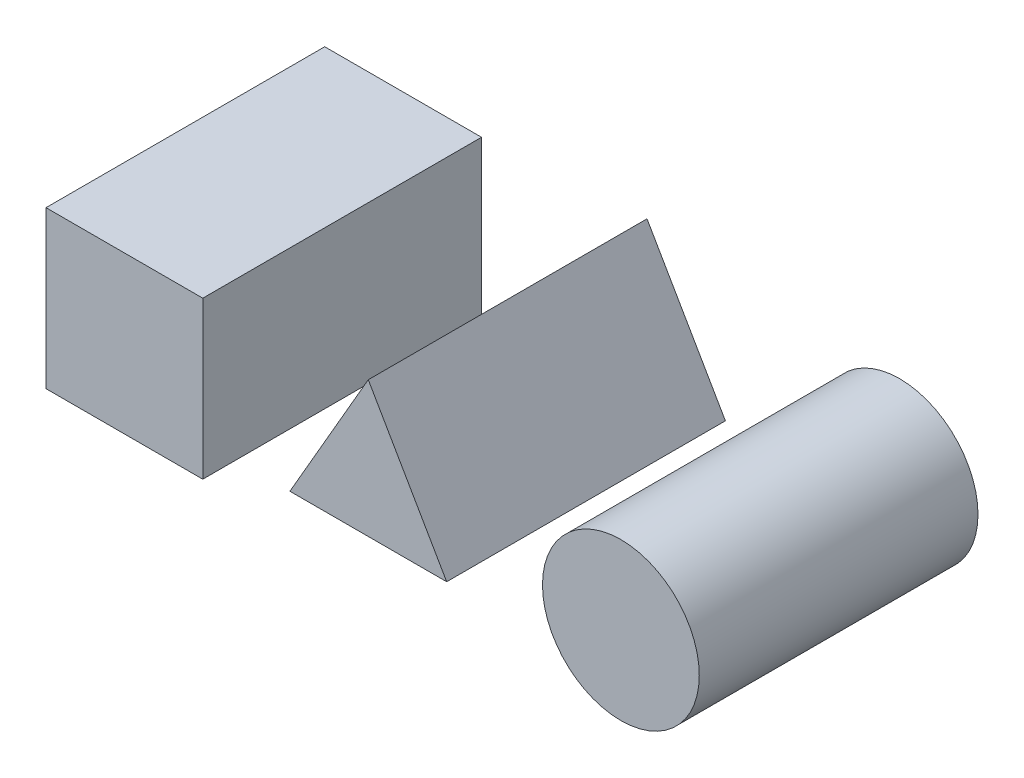
ISO-10303-21;
HEADER;
FILE_DESCRIPTION(('STEP AP214'),'2;1');
FILE_NAME('part.step','',(''),(''),'','','');
FILE_SCHEMA(('AUTOMOTIVE_DESIGN { 1 0 10303 214 1 1 1 1 }'));
ENDSEC;
DATA;
#1=APPLICATION_CONTEXT('core data for automotive mechanical design processes');
#2=APPLICATION_PROTOCOL_DEFINITION('international standard','automotive_design',2000,#1);
#3=PRODUCT_CONTEXT('',#1,'mechanical');
#4=PRODUCT('Part','Part','',(#3));
#5=PRODUCT_RELATED_PRODUCT_CATEGORY('part','',(#4));
#6=PRODUCT_DEFINITION_FORMATION('','',#4);
#7=PRODUCT_DEFINITION_CONTEXT('part definition',#1,'design');
#8=PRODUCT_DEFINITION('design','',#6,#7);
#9=PRODUCT_DEFINITION_SHAPE('','',#8);
#10=(LENGTH_UNIT() NAMED_UNIT(*) SI_UNIT(.MILLI.,.METRE.));
#11=(NAMED_UNIT(*) PLANE_ANGLE_UNIT() SI_UNIT($,.RADIAN.));
#12=(NAMED_UNIT(*) SI_UNIT($,.STERADIAN.) SOLID_ANGLE_UNIT());
#13=UNCERTAINTY_MEASURE_WITH_UNIT(LENGTH_MEASURE(1.E-05),#10,'distance_accuracy_value','');
#14=(GEOMETRIC_REPRESENTATION_CONTEXT(3) GLOBAL_UNCERTAINTY_ASSIGNED_CONTEXT((#13)) GLOBAL_UNIT_ASSIGNED_CONTEXT((#10,
#11,#12)) REPRESENTATION_CONTEXT('',''));
#15=CARTESIAN_POINT('',(0.,0.,0.));
#16=DIRECTION('',(0.,0.,1.));
#17=DIRECTION('',(1.,0.,0.));
#18=AXIS2_PLACEMENT_3D('',#15,#16,#17);
#19=CARTESIAN_POINT('',(72.5,0.,80.));
#20=DIRECTION('',(0.,0.,-1.));
#21=DIRECTION('',(-1.,0.,0.));
#22=AXIS2_PLACEMENT_3D('',#19,#20,#21);
#23=CYLINDRICAL_SURFACE('',#22,22.5);
#24=CARTESIAN_POINT('',(72.5,0.,80.));
#25=DIRECTION('',(0.,0.,1.));
#26=DIRECTION('',(1.,0.,0.));
#27=AXIS2_PLACEMENT_3D('',#24,#25,#26);
#28=CIRCLE('',#27,22.5);
#29=CARTESIAN_POINT('',(95.,0.,80.));
#30=VERTEX_POINT('',#29);
#31=EDGE_CURVE('E11',#30,#30,#28,.T.);
#32=ORIENTED_EDGE('',*,*,#31,.F.);
#33=EDGE_LOOP('',(#32));
#34=FACE_BOUND('',#33,.T.);
#35=CARTESIAN_POINT('',(72.5,0.,0.));
#36=DIRECTION('',(0.,0.,1.));
#37=DIRECTION('',(1.,0.,0.));
#38=AXIS2_PLACEMENT_3D('',#35,#36,#37);
#39=CIRCLE('',#38,22.5);
#40=CARTESIAN_POINT('',(95.,0.,0.));
#41=VERTEX_POINT('',#40);
#42=EDGE_CURVE('E53',#41,#41,#39,.T.);
#43=ORIENTED_EDGE('',*,*,#42,.T.);
#44=EDGE_LOOP('',(#43));
#45=FACE_BOUND('',#44,.T.);
#46=ADVANCED_FACE('F50',(#34,#45),#23,.T.);
#47=CARTESIAN_POINT('',(0.,0.,80.));
#48=DIRECTION('',(0.,0.,1.));
#49=DIRECTION('',(1.,0.,0.));
#50=AXIS2_PLACEMENT_3D('',#47,#48,#49);
#51=PLANE('',#50);
#52=ORIENTED_EDGE('',*,*,#31,.T.);
#53=EDGE_LOOP('',(#52));
#54=FACE_BOUND('',#53,.T.);
#55=ADVANCED_FACE('F65',(#54),#51,.T.);
#56=CARTESIAN_POINT('',(0.,0.,0.));
#57=DIRECTION('',(0.,0.,1.));
#58=DIRECTION('',(1.,0.,0.));
#59=AXIS2_PLACEMENT_3D('',#56,#57,#58);
#60=PLANE('',#59);
#61=ORIENTED_EDGE('',*,*,#42,.F.);
#62=EDGE_LOOP('',(#61));
#63=FACE_BOUND('',#62,.T.);
#64=ADVANCED_FACE('F63',(#63),#60,.F.);
#65=CLOSED_SHELL('',(#46,#55,#64));
#66=MANIFOLD_SOLID_BREP('B2',#65);
#67=CARTESIAN_POINT('',(-47.5,0.,80.));
#68=DIRECTION('',(1.,0.,0.));
#69=DIRECTION('',(0.,1.,0.));
#70=AXIS2_PLACEMENT_3D('',#67,#68,#69);
#71=PLANE('',#70);
#72=DIRECTION('',(0.,-1.,0.));
#73=VECTOR('',#72,1.);
#74=CARTESIAN_POINT('',(-47.5,0.,0.));
#75=LINE('',#74,#73);
#76=CARTESIAN_POINT('',(-47.5,22.5,0.));
#77=VERTEX_POINT('',#76);
#78=CARTESIAN_POINT('',(-47.5,-22.5,0.));
#79=VERTEX_POINT('',#78);
#80=EDGE_CURVE('E169',#77,#79,#75,.T.);
#81=ORIENTED_EDGE('',*,*,#80,.F.);
#82=DIRECTION('',(0.,0.,-1.));
#83=VECTOR('',#82,1.);
#84=CARTESIAN_POINT('',(-47.5,22.5,80.));
#85=LINE('',#84,#83);
#86=CARTESIAN_POINT('',(-47.5,22.5,80.));
#87=VERTEX_POINT('',#86);
#88=EDGE_CURVE('E48',#87,#77,#85,.T.);
#89=ORIENTED_EDGE('',*,*,#88,.F.);
#90=DIRECTION('',(0.,-1.,0.));
#91=VECTOR('',#90,1.);
#92=CARTESIAN_POINT('',(-47.5,0.,80.));
#93=LINE('',#92,#91);
#94=CARTESIAN_POINT('',(-47.5,-22.5,80.));
#95=VERTEX_POINT('',#94);
#96=EDGE_CURVE('E160',#87,#95,#93,.T.);
#97=ORIENTED_EDGE('',*,*,#96,.T.);
#98=DIRECTION('',(0.,0.,-1.));
#99=VECTOR('',#98,1.);
#100=CARTESIAN_POINT('',(-47.5,-22.5,80.));
#101=LINE('',#100,#99);
#102=EDGE_CURVE('E139',#95,#79,#101,.T.);
#103=ORIENTED_EDGE('',*,*,#102,.T.);
#104=EDGE_LOOP('',(#81,#89,#97,#103));
#105=FACE_BOUND('',#104,.T.);
#106=ADVANCED_FACE('F100',(#105),#71,.T.);
#107=CARTESIAN_POINT('',(0.,22.5000000000001,80.));
#108=DIRECTION('',(0.,1.,0.));
#109=DIRECTION('',(-1.,0.,0.));
#110=AXIS2_PLACEMENT_3D('',#107,#108,#109);
#111=PLANE('',#110);
#112=DIRECTION('',(1.,0.,0.));
#113=VECTOR('',#112,1.);
#114=CARTESIAN_POINT('',(0.,22.5000000000001,0.));
#115=LINE('',#114,#113);
#116=CARTESIAN_POINT('',(-92.5,22.5,0.));
#117=VERTEX_POINT('',#116);
#118=EDGE_CURVE('E152',#117,#77,#115,.T.);
#119=ORIENTED_EDGE('',*,*,#118,.F.);
#120=DIRECTION('',(0.,0.,-1.));
#121=VECTOR('',#120,1.);
#122=CARTESIAN_POINT('',(-92.5,22.5,80.));
#123=LINE('',#122,#121);
#124=CARTESIAN_POINT('',(-92.5,22.5,80.));
#125=VERTEX_POINT('',#124);
#126=EDGE_CURVE('E109',#125,#117,#123,.T.);
#127=ORIENTED_EDGE('',*,*,#126,.F.);
#128=DIRECTION('',(1.,0.,0.));
#129=VECTOR('',#128,1.);
#130=CARTESIAN_POINT('',(0.,22.5000000000001,80.));
#131=LINE('',#130,#129);
#132=EDGE_CURVE('E150',#125,#87,#131,.T.);
#133=ORIENTED_EDGE('',*,*,#132,.T.);
#134=ORIENTED_EDGE('',*,*,#88,.T.);
#135=EDGE_LOOP('',(#119,#127,#133,#134));
#136=FACE_BOUND('',#135,.T.);
#137=ADVANCED_FACE('F148',(#136),#111,.T.);
#138=CARTESIAN_POINT('',(-92.5,0.,80.));
#139=DIRECTION('',(1.,0.,0.));
#140=DIRECTION('',(0.,1.,0.));
#141=AXIS2_PLACEMENT_3D('',#138,#139,#140);
#142=PLANE('',#141);
#143=DIRECTION('',(0.,-1.,0.));
#144=VECTOR('',#143,1.);
#145=CARTESIAN_POINT('',(-92.5,0.,0.));
#146=LINE('',#145,#144);
#147=CARTESIAN_POINT('',(-92.5,-22.5,0.));
#148=VERTEX_POINT('',#147);
#149=EDGE_CURVE('E132',#117,#148,#146,.T.);
#150=ORIENTED_EDGE('',*,*,#149,.T.);
#151=DIRECTION('',(0.,0.,-1.));
#152=VECTOR('',#151,1.);
#153=CARTESIAN_POINT('',(-92.5,-22.5,80.));
#154=LINE('',#153,#152);
#155=CARTESIAN_POINT('',(-92.5,-22.5,80.));
#156=VERTEX_POINT('',#155);
#157=EDGE_CURVE('E154',#156,#148,#154,.T.);
#158=ORIENTED_EDGE('',*,*,#157,.F.);
#159=DIRECTION('',(0.,-1.,0.));
#160=VECTOR('',#159,1.);
#161=CARTESIAN_POINT('',(-92.5,0.,80.));
#162=LINE('',#161,#160);
#163=EDGE_CURVE('E155',#125,#156,#162,.T.);
#164=ORIENTED_EDGE('',*,*,#163,.F.);
#165=ORIENTED_EDGE('',*,*,#126,.T.);
#166=EDGE_LOOP('',(#150,#158,#164,#165));
#167=FACE_BOUND('',#166,.T.);
#168=ADVANCED_FACE('F156',(#167),#142,.F.);
#169=CARTESIAN_POINT('',(0.,-22.5,80.));
#170=DIRECTION('',(0.,1.,0.));
#171=DIRECTION('',(-1.,0.,0.));
#172=AXIS2_PLACEMENT_3D('',#169,#170,#171);
#173=PLANE('',#172);
#174=DIRECTION('',(1.,0.,0.));
#175=VECTOR('',#174,1.);
#176=CARTESIAN_POINT('',(0.,-22.5,0.));
#177=LINE('',#176,#175);
#178=EDGE_CURVE('E164',#148,#79,#177,.T.);
#179=ORIENTED_EDGE('',*,*,#178,.T.);
#180=ORIENTED_EDGE('',*,*,#102,.F.);
#181=DIRECTION('',(1.,0.,0.));
#182=VECTOR('',#181,1.);
#183=CARTESIAN_POINT('',(0.,-22.5,80.));
#184=LINE('',#183,#182);
#185=EDGE_CURVE('E117',#156,#95,#184,.T.);
#186=ORIENTED_EDGE('',*,*,#185,.F.);
#187=ORIENTED_EDGE('',*,*,#157,.T.);
#188=EDGE_LOOP('',(#179,#180,#186,#187));
#189=FACE_BOUND('',#188,.T.);
#190=ADVANCED_FACE('F184',(#189),#173,.F.);
#191=CARTESIAN_POINT('',(0.,0.,80.));
#192=DIRECTION('',(0.,0.,1.));
#193=DIRECTION('',(1.,0.,0.));
#194=AXIS2_PLACEMENT_3D('',#191,#192,#193);
#195=PLANE('',#194);
#196=ORIENTED_EDGE('',*,*,#96,.F.);
#197=ORIENTED_EDGE('',*,*,#132,.F.);
#198=ORIENTED_EDGE('',*,*,#163,.T.);
#199=ORIENTED_EDGE('',*,*,#185,.T.);
#200=EDGE_LOOP('',(#196,#197,#198,#199));
#201=FACE_BOUND('',#200,.T.);
#202=ADVANCED_FACE('F159',(#201),#195,.T.);
#203=CARTESIAN_POINT('',(0.,0.,0.));
#204=DIRECTION('',(0.,0.,1.));
#205=DIRECTION('',(1.,0.,0.));
#206=AXIS2_PLACEMENT_3D('',#203,#204,#205);
#207=PLANE('',#206);
#208=ORIENTED_EDGE('',*,*,#80,.T.);
#209=ORIENTED_EDGE('',*,*,#178,.F.);
#210=ORIENTED_EDGE('',*,*,#149,.F.);
#211=ORIENTED_EDGE('',*,*,#118,.T.);
#212=EDGE_LOOP('',(#208,#209,#210,#211));
#213=FACE_BOUND('',#212,.T.);
#214=ADVANCED_FACE('F186',(#213),#207,.F.);
#215=CLOSED_SHELL('',(#106,#137,#168,#190,#202,#214));
#216=MANIFOLD_SOLID_BREP('B6',#215);
#217=CARTESIAN_POINT('',(0.,-12.9903810567665,80.));
#218=DIRECTION('',(0.,-1.,0.));
#219=DIRECTION('',(1.,0.,0.));
#220=AXIS2_PLACEMENT_3D('',#217,#218,#219);
#221=PLANE('',#220);
#222=DIRECTION('',(-1.,0.,0.));
#223=VECTOR('',#222,1.);
#224=CARTESIAN_POINT('',(0.,-12.9903810567665,0.));
#225=LINE('',#224,#223);
#226=CARTESIAN_POINT('',(22.5,-12.9903810567665,0.));
#227=VERTEX_POINT('',#226);
#228=CARTESIAN_POINT('',(-22.5,-12.9903810567665,0.));
#229=VERTEX_POINT('',#228);
#230=EDGE_CURVE('E270',#227,#229,#225,.T.);
#231=ORIENTED_EDGE('',*,*,#230,.F.);
#232=DIRECTION('',(0.,0.,-1.));
#233=VECTOR('',#232,1.);
#234=CARTESIAN_POINT('',(22.5,-12.9903810567665,80.));
#235=LINE('',#234,#233);
#236=CARTESIAN_POINT('',(22.5,-12.9903810567665,80.));
#237=VERTEX_POINT('',#236);
#238=EDGE_CURVE('E98',#237,#227,#235,.T.);
#239=ORIENTED_EDGE('',*,*,#238,.F.);
#240=DIRECTION('',(-1.,0.,0.));
#241=VECTOR('',#240,1.);
#242=CARTESIAN_POINT('',(0.,-12.9903810567665,80.));
#243=LINE('',#242,#241);
#244=CARTESIAN_POINT('',(-22.5,-12.9903810567665,80.));
#245=VERTEX_POINT('',#244);
#246=EDGE_CURVE('E268',#237,#245,#243,.T.);
#247=ORIENTED_EDGE('',*,*,#246,.T.);
#248=DIRECTION('',(0.,0.,-1.));
#249=VECTOR('',#248,1.);
#250=CARTESIAN_POINT('',(-22.5,-12.9903810567665,80.));
#251=LINE('',#250,#249);
#252=EDGE_CURVE('E252',#245,#229,#251,.T.);
#253=ORIENTED_EDGE('',*,*,#252,.T.);
#254=EDGE_LOOP('',(#231,#239,#247,#253));
#255=FACE_BOUND('',#254,.T.);
#256=ADVANCED_FACE('F236',(#255),#221,.T.);
#257=CARTESIAN_POINT('',(11.25,6.4951905283833,80.));
#258=DIRECTION('',(0.866025403784438,0.5,0.));
#259=DIRECTION('',(-0.5,0.866025403784438,0.));
#260=AXIS2_PLACEMENT_3D('',#257,#258,#259);
#261=PLANE('',#260);
#262=DIRECTION('',(0.5,-0.866025403784439,0.));
#263=VECTOR('',#262,1.);
#264=CARTESIAN_POINT('',(11.25,6.4951905283833,0.));
#265=LINE('',#264,#263);
#266=CARTESIAN_POINT('',(0.,25.9807621135332,0.));
#267=VERTEX_POINT('',#266);
#268=EDGE_CURVE('E286',#267,#227,#265,.T.);
#269=ORIENTED_EDGE('',*,*,#268,.F.);
#270=DIRECTION('',(0.,0.,-1.));
#271=VECTOR('',#270,1.);
#272=CARTESIAN_POINT('',(0.,25.9807621135332,80.));
#273=LINE('',#272,#271);
#274=CARTESIAN_POINT('',(0.,25.9807621135332,80.));
#275=VERTEX_POINT('',#274);
#276=EDGE_CURVE('E244',#275,#267,#273,.T.);
#277=ORIENTED_EDGE('',*,*,#276,.F.);
#278=DIRECTION('',(0.5,-0.866025403784439,0.));
#279=VECTOR('',#278,1.);
#280=CARTESIAN_POINT('',(11.25,6.4951905283833,80.));
#281=LINE('',#280,#279);
#282=EDGE_CURVE('E277',#275,#237,#281,.T.);
#283=ORIENTED_EDGE('',*,*,#282,.T.);
#284=ORIENTED_EDGE('',*,*,#238,.T.);
#285=EDGE_LOOP('',(#269,#277,#283,#284));
#286=FACE_BOUND('',#285,.T.);
#287=ADVANCED_FACE('F281',(#286),#261,.T.);
#288=CARTESIAN_POINT('',(-11.25,6.49519052838329,80.));
#289=DIRECTION('',(-0.866025403784439,0.5,0.));
#290=DIRECTION('',(-0.5,-0.866025403784439,0.));
#291=AXIS2_PLACEMENT_3D('',#288,#289,#290);
#292=PLANE('',#291);
#293=DIRECTION('',(0.5,0.866025403784439,0.));
#294=VECTOR('',#293,1.);
#295=CARTESIAN_POINT('',(-11.25,6.49519052838329,0.));
#296=LINE('',#295,#294);
#297=EDGE_CURVE('E279',#229,#267,#296,.T.);
#298=ORIENTED_EDGE('',*,*,#297,.F.);
#299=ORIENTED_EDGE('',*,*,#252,.F.);
#300=DIRECTION('',(0.5,0.866025403784439,0.));
#301=VECTOR('',#300,1.);
#302=CARTESIAN_POINT('',(-11.25,6.49519052838329,80.));
#303=LINE('',#302,#301);
#304=EDGE_CURVE('E278',#245,#275,#303,.T.);
#305=ORIENTED_EDGE('',*,*,#304,.T.);
#306=ORIENTED_EDGE('',*,*,#276,.T.);
#307=EDGE_LOOP('',(#298,#299,#305,#306));
#308=FACE_BOUND('',#307,.T.);
#309=ADVANCED_FACE('F292',(#308),#292,.T.);
#310=CARTESIAN_POINT('',(0.,0.,80.));
#311=DIRECTION('',(0.,0.,1.));
#312=DIRECTION('',(1.,0.,0.));
#313=AXIS2_PLACEMENT_3D('',#310,#311,#312);
#314=PLANE('',#313);
#315=ORIENTED_EDGE('',*,*,#246,.F.);
#316=ORIENTED_EDGE('',*,*,#282,.F.);
#317=ORIENTED_EDGE('',*,*,#304,.F.);
#318=EDGE_LOOP('',(#315,#316,#317));
#319=FACE_BOUND('',#318,.T.);
#320=ADVANCED_FACE('F276',(#319),#314,.T.);
#321=CARTESIAN_POINT('',(0.,0.,0.));
#322=DIRECTION('',(0.,0.,1.));
#323=DIRECTION('',(1.,0.,0.));
#324=AXIS2_PLACEMENT_3D('',#321,#322,#323);
#325=PLANE('',#324);
#326=ORIENTED_EDGE('',*,*,#230,.T.);
#327=ORIENTED_EDGE('',*,*,#297,.T.);
#328=ORIENTED_EDGE('',*,*,#268,.T.);
#329=EDGE_LOOP('',(#326,#327,#328));
#330=FACE_BOUND('',#329,.T.);
#331=ADVANCED_FACE('F291',(#330),#325,.F.);
#332=CLOSED_SHELL('',(#256,#287,#309,#320,#331));
#333=MANIFOLD_SOLID_BREP('B42',#332);
#334=ADVANCED_BREP_SHAPE_REPRESENTATION('',(#18,#66,#216,#333),#14);
#335=SHAPE_DEFINITION_REPRESENTATION(#9,#334);
ENDSEC;
END-ISO-10303-21;
